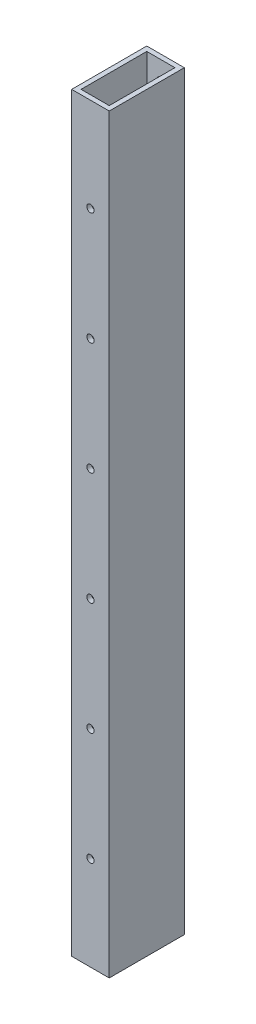
ISO-10303-21;
HEADER;
FILE_DESCRIPTION(('STEP AP214'),'2;1');
FILE_NAME('part.step','',(''),(''),'','','');
FILE_SCHEMA(('AUTOMOTIVE_DESIGN { 1 0 10303 214 1 1 1 1 }'));
ENDSEC;
DATA;
#1=APPLICATION_CONTEXT('core data for automotive mechanical design processes');
#2=APPLICATION_PROTOCOL_DEFINITION('international standard','automotive_design',2000,#1);
#3=PRODUCT_CONTEXT('',#1,'mechanical');
#4=PRODUCT('Part','Part','',(#3));
#5=PRODUCT_RELATED_PRODUCT_CATEGORY('part','',(#4));
#6=PRODUCT_DEFINITION_FORMATION('','',#4);
#7=PRODUCT_DEFINITION_CONTEXT('part definition',#1,'design');
#8=PRODUCT_DEFINITION('design','',#6,#7);
#9=PRODUCT_DEFINITION_SHAPE('','',#8);
#10=(LENGTH_UNIT() NAMED_UNIT(*) SI_UNIT(.MILLI.,.METRE.));
#11=(NAMED_UNIT(*) PLANE_ANGLE_UNIT() SI_UNIT($,.RADIAN.));
#12=(NAMED_UNIT(*) SI_UNIT($,.STERADIAN.) SOLID_ANGLE_UNIT());
#13=UNCERTAINTY_MEASURE_WITH_UNIT(LENGTH_MEASURE(1.E-05),#10,'distance_accuracy_value','');
#14=(GEOMETRIC_REPRESENTATION_CONTEXT(3) GLOBAL_UNCERTAINTY_ASSIGNED_CONTEXT((#13)) GLOBAL_UNIT_ASSIGNED_CONTEXT((#10,
#11,#12)) REPRESENTATION_CONTEXT('',''));
#15=CARTESIAN_POINT('',(0.,0.,0.));
#16=DIRECTION('',(0.,0.,1.));
#17=DIRECTION('',(1.,0.,0.));
#18=AXIS2_PLACEMENT_3D('',#15,#16,#17);
#19=CARTESIAN_POINT('',(0.,508.,0.));
#20=DIRECTION('',(0.,-1.,0.));
#21=DIRECTION('',(0.,0.,-1.));
#22=AXIS2_PLACEMENT_3D('',#19,#20,#21);
#23=PLANE('',#22);
#24=DIRECTION('',(0.,0.,1.));
#25=VECTOR('',#24,1.);
#26=CARTESIAN_POINT('',(0.,508.,0.));
#27=LINE('',#26,#25);
#28=CARTESIAN_POINT('',(0.,508.,-50.8));
#29=VERTEX_POINT('',#28);
#30=CARTESIAN_POINT('',(0.,508.,0.));
#31=VERTEX_POINT('',#30);
#32=EDGE_CURVE('E135',#29,#31,#27,.T.);
#33=ORIENTED_EDGE('',*,*,#32,.T.);
#34=DIRECTION('',(1.,0.,0.));
#35=VECTOR('',#34,1.);
#36=CARTESIAN_POINT('',(0.,508.,0.));
#37=LINE('',#36,#35);
#38=CARTESIAN_POINT('',(25.4,508.,0.));
#39=VERTEX_POINT('',#38);
#40=EDGE_CURVE('E138',#31,#39,#37,.T.);
#41=ORIENTED_EDGE('',*,*,#40,.T.);
#42=DIRECTION('',(0.,0.,-1.));
#43=VECTOR('',#42,1.);
#44=CARTESIAN_POINT('',(25.4,508.,0.));
#45=LINE('',#44,#43);
#46=CARTESIAN_POINT('',(25.4,508.,-50.8));
#47=VERTEX_POINT('',#46);
#48=EDGE_CURVE('E141',#39,#47,#45,.T.);
#49=ORIENTED_EDGE('',*,*,#48,.T.);
#50=DIRECTION('',(-1.,0.,0.));
#51=VECTOR('',#50,1.);
#52=CARTESIAN_POINT('',(0.,508.,-50.8));
#53=LINE('',#52,#51);
#54=EDGE_CURVE('E143',#47,#29,#53,.T.);
#55=ORIENTED_EDGE('',*,*,#54,.T.);
#56=EDGE_LOOP('',(#33,#41,#49,#55));
#57=FACE_BOUND('',#56,.T.);
#58=DIRECTION('',(1.,0.,0.));
#59=VECTOR('',#58,1.);
#60=CARTESIAN_POINT('',(3.175,508.,-3.175));
#61=LINE('',#60,#59);
#62=CARTESIAN_POINT('',(3.175,508.,-3.175));
#63=VERTEX_POINT('',#62);
#64=CARTESIAN_POINT('',(22.225,508.,-3.175));
#65=VERTEX_POINT('',#64);
#66=EDGE_CURVE('E97',#63,#65,#61,.T.);
#67=ORIENTED_EDGE('',*,*,#66,.F.);
#68=DIRECTION('',(0.,0.,1.));
#69=VECTOR('',#68,1.);
#70=CARTESIAN_POINT('',(3.175,508.,-3.175));
#71=LINE('',#70,#69);
#72=CARTESIAN_POINT('',(3.175,508.,-47.625));
#73=VERTEX_POINT('',#72);
#74=EDGE_CURVE('E119',#73,#63,#71,.T.);
#75=ORIENTED_EDGE('',*,*,#74,.F.);
#76=DIRECTION('',(-1.,0.,0.));
#77=VECTOR('',#76,1.);
#78=CARTESIAN_POINT('',(3.175,508.,-47.625));
#79=LINE('',#78,#77);
#80=CARTESIAN_POINT('',(22.225,508.,-47.625));
#81=VERTEX_POINT('',#80);
#82=EDGE_CURVE('E117',#81,#73,#79,.T.);
#83=ORIENTED_EDGE('',*,*,#82,.F.);
#84=DIRECTION('',(0.,0.,-1.));
#85=VECTOR('',#84,1.);
#86=CARTESIAN_POINT('',(22.225,508.,-3.175));
#87=LINE('',#86,#85);
#88=EDGE_CURVE('E105',#65,#81,#87,.T.);
#89=ORIENTED_EDGE('',*,*,#88,.F.);
#90=EDGE_LOOP('',(#67,#75,#83,#89));
#91=FACE_BOUND('',#90,.T.);
#92=ADVANCED_FACE('F32',(#57,#91),#23,.F.);
#93=CARTESIAN_POINT('',(0.,0.,0.));
#94=DIRECTION('',(0.,-1.,0.));
#95=DIRECTION('',(0.,0.,-1.));
#96=AXIS2_PLACEMENT_3D('',#93,#94,#95);
#97=PLANE('',#96);
#98=DIRECTION('',(0.,0.,1.));
#99=VECTOR('',#98,1.);
#100=CARTESIAN_POINT('',(0.,0.,0.));
#101=LINE('',#100,#99);
#102=CARTESIAN_POINT('',(0.,0.,-50.8));
#103=VERTEX_POINT('',#102);
#104=CARTESIAN_POINT('',(0.,0.,0.));
#105=VERTEX_POINT('',#104);
#106=EDGE_CURVE('E113',#103,#105,#101,.T.);
#107=ORIENTED_EDGE('',*,*,#106,.F.);
#108=DIRECTION('',(-1.,0.,0.));
#109=VECTOR('',#108,1.);
#110=CARTESIAN_POINT('',(0.,0.,-50.8));
#111=LINE('',#110,#109);
#112=CARTESIAN_POINT('',(25.4,0.,-50.8));
#113=VERTEX_POINT('',#112);
#114=EDGE_CURVE('E139',#113,#103,#111,.T.);
#115=ORIENTED_EDGE('',*,*,#114,.F.);
#116=DIRECTION('',(0.,0.,-1.));
#117=VECTOR('',#116,1.);
#118=CARTESIAN_POINT('',(25.4,0.,0.));
#119=LINE('',#118,#117);
#120=CARTESIAN_POINT('',(25.4,0.,0.));
#121=VERTEX_POINT('',#120);
#122=EDGE_CURVE('E150',#121,#113,#119,.T.);
#123=ORIENTED_EDGE('',*,*,#122,.F.);
#124=DIRECTION('',(1.,0.,0.));
#125=VECTOR('',#124,1.);
#126=CARTESIAN_POINT('',(0.,0.,0.));
#127=LINE('',#126,#125);
#128=EDGE_CURVE('E148',#105,#121,#127,.T.);
#129=ORIENTED_EDGE('',*,*,#128,.F.);
#130=EDGE_LOOP('',(#107,#115,#123,#129));
#131=FACE_BOUND('',#130,.T.);
#132=DIRECTION('',(0.,0.,1.));
#133=VECTOR('',#132,1.);
#134=CARTESIAN_POINT('',(3.175,0.,-3.175));
#135=LINE('',#134,#133);
#136=CARTESIAN_POINT('',(3.175,0.,-47.625));
#137=VERTEX_POINT('',#136);
#138=CARTESIAN_POINT('',(3.175,0.,-3.175));
#139=VERTEX_POINT('',#138);
#140=EDGE_CURVE('E106',#137,#139,#135,.T.);
#141=ORIENTED_EDGE('',*,*,#140,.T.);
#142=DIRECTION('',(1.,0.,0.));
#143=VECTOR('',#142,1.);
#144=CARTESIAN_POINT('',(3.175,0.,-3.175));
#145=LINE('',#144,#143);
#146=CARTESIAN_POINT('',(22.225,0.,-3.175));
#147=VERTEX_POINT('',#146);
#148=EDGE_CURVE('E55',#139,#147,#145,.T.);
#149=ORIENTED_EDGE('',*,*,#148,.T.);
#150=DIRECTION('',(0.,0.,-1.));
#151=VECTOR('',#150,1.);
#152=CARTESIAN_POINT('',(22.225,0.,-3.175));
#153=LINE('',#152,#151);
#154=CARTESIAN_POINT('',(22.225,0.,-47.625));
#155=VERTEX_POINT('',#154);
#156=EDGE_CURVE('E112',#147,#155,#153,.T.);
#157=ORIENTED_EDGE('',*,*,#156,.T.);
#158=DIRECTION('',(-1.,0.,0.));
#159=VECTOR('',#158,1.);
#160=CARTESIAN_POINT('',(3.175,0.,-47.625));
#161=LINE('',#160,#159);
#162=EDGE_CURVE('E127',#155,#137,#161,.T.);
#163=ORIENTED_EDGE('',*,*,#162,.T.);
#164=EDGE_LOOP('',(#141,#149,#157,#163));
#165=FACE_BOUND('',#164,.T.);
#166=ADVANCED_FACE('F168',(#131,#165),#97,.T.);
#167=CARTESIAN_POINT('',(0.,508.,0.));
#168=DIRECTION('',(1.,0.,0.));
#169=DIRECTION('',(0.,0.,-1.));
#170=AXIS2_PLACEMENT_3D('',#167,#168,#169);
#171=PLANE('',#170);
#172=CARTESIAN_POINT('',(0.,411.364898332171,-38.110518667742));
#173=DIRECTION('',(-1.,0.,0.));
#174=DIRECTION('',(0.,0.,1.));
#175=AXIS2_PLACEMENT_3D('',#172,#173,#174);
#176=CIRCLE('',#175,2.57968749999999);
#177=CARTESIAN_POINT('',(0.,411.364898332171,-35.530831167742));
#178=VERTEX_POINT('',#177);
#179=EDGE_CURVE('E323',#178,#178,#176,.T.);
#180=ORIENTED_EDGE('',*,*,#179,.F.);
#181=EDGE_LOOP('',(#180));
#182=FACE_BOUND('',#181,.T.);
#183=CARTESIAN_POINT('',(0.,411.364898332172,-12.710518667742));
#184=DIRECTION('',(-1.,0.,0.));
#185=DIRECTION('',(0.,0.,1.));
#186=AXIS2_PLACEMENT_3D('',#183,#184,#185);
#187=CIRCLE('',#186,2.5796875);
#188=CARTESIAN_POINT('',(0.,411.364898332172,-10.130831167742));
#189=VERTEX_POINT('',#188);
#190=EDGE_CURVE('E335',#189,#189,#187,.T.);
#191=ORIENTED_EDGE('',*,*,#190,.F.);
#192=EDGE_LOOP('',(#191));
#193=FACE_BOUND('',#192,.T.);
#194=CARTESIAN_POINT('',(0.,96.6351016623964,-12.7105186677505));
#195=DIRECTION('',(-1.,0.,0.));
#196=DIRECTION('',(0.,0.,1.));
#197=AXIS2_PLACEMENT_3D('',#194,#195,#196);
#198=CIRCLE('',#197,2.5796875);
#199=CARTESIAN_POINT('',(0.,96.6351016623964,-10.1308311677505));
#200=VERTEX_POINT('',#199);
#201=EDGE_CURVE('E329',#200,#200,#198,.T.);
#202=ORIENTED_EDGE('',*,*,#201,.F.);
#203=EDGE_LOOP('',(#202));
#204=FACE_BOUND('',#203,.T.);
#205=CARTESIAN_POINT('',(0.,96.6351016623965,-38.1105186677505));
#206=DIRECTION('',(-1.,0.,0.));
#207=DIRECTION('',(0.,0.,1.));
#208=AXIS2_PLACEMENT_3D('',#205,#206,#207);
#209=CIRCLE('',#208,2.5796875);
#210=CARTESIAN_POINT('',(0.,96.6351016623965,-35.5308311677505));
#211=VERTEX_POINT('',#210);
#212=EDGE_CURVE('E297',#211,#211,#209,.T.);
#213=ORIENTED_EDGE('',*,*,#212,.F.);
#214=EDGE_LOOP('',(#213));
#215=FACE_BOUND('',#214,.T.);
#216=ORIENTED_EDGE('',*,*,#106,.T.);
#217=DIRECTION('',(0.,-1.,0.));
#218=VECTOR('',#217,1.);
#219=CARTESIAN_POINT('',(0.,508.,0.));
#220=LINE('',#219,#218);
#221=EDGE_CURVE('E11',#31,#105,#220,.T.);
#222=ORIENTED_EDGE('',*,*,#221,.F.);
#223=ORIENTED_EDGE('',*,*,#32,.F.);
#224=DIRECTION('',(0.,-1.,0.));
#225=VECTOR('',#224,1.);
#226=CARTESIAN_POINT('',(0.,508.,-50.8));
#227=LINE('',#226,#225);
#228=EDGE_CURVE('E145',#29,#103,#227,.T.);
#229=ORIENTED_EDGE('',*,*,#228,.T.);
#230=EDGE_LOOP('',(#216,#222,#223,#229));
#231=FACE_BOUND('',#230,.T.);
#232=ADVANCED_FACE('F34',(#182,#193,#204,#215,#231),#171,.F.);
#233=CARTESIAN_POINT('',(0.,508.,0.));
#234=DIRECTION('',(0.,0.,-1.));
#235=DIRECTION('',(-1.,0.,0.));
#236=AXIS2_PLACEMENT_3D('',#233,#234,#235);
#237=PLANE('',#236);
#238=CARTESIAN_POINT('',(12.7000000000002,139.7,0.));
#239=DIRECTION('',(0.,0.,1.));
#240=DIRECTION('',(1.,0.,0.));
#241=AXIS2_PLACEMENT_3D('',#238,#239,#240);
#242=CIRCLE('',#241,2.46380000000002);
#243=CARTESIAN_POINT('',(15.1638000000002,139.7,0.));
#244=VERTEX_POINT('',#243);
#245=EDGE_CURVE('E289',#244,#244,#242,.T.);
#246=ORIENTED_EDGE('',*,*,#245,.F.);
#247=EDGE_LOOP('',(#246));
#248=FACE_BOUND('',#247,.T.);
#249=CARTESIAN_POINT('',(12.7000000000002,215.9,0.));
#250=DIRECTION('',(0.,0.,1.));
#251=DIRECTION('',(1.,0.,0.));
#252=AXIS2_PLACEMENT_3D('',#249,#250,#251);
#253=CIRCLE('',#252,2.46380000000002);
#254=CARTESIAN_POINT('',(15.1638000000002,215.9,0.));
#255=VERTEX_POINT('',#254);
#256=EDGE_CURVE('E312',#255,#255,#253,.T.);
#257=ORIENTED_EDGE('',*,*,#256,.F.);
#258=EDGE_LOOP('',(#257));
#259=FACE_BOUND('',#258,.T.);
#260=CARTESIAN_POINT('',(12.7000000000002,292.1,0.));
#261=DIRECTION('',(0.,0.,1.));
#262=DIRECTION('',(1.,0.,0.));
#263=AXIS2_PLACEMENT_3D('',#260,#261,#262);
#264=CIRCLE('',#263,2.4638);
#265=CARTESIAN_POINT('',(15.1638000000002,292.1,0.));
#266=VERTEX_POINT('',#265);
#267=EDGE_CURVE('E306',#266,#266,#264,.T.);
#268=ORIENTED_EDGE('',*,*,#267,.F.);
#269=EDGE_LOOP('',(#268));
#270=FACE_BOUND('',#269,.T.);
#271=CARTESIAN_POINT('',(12.7000000000002,368.3,0.));
#272=DIRECTION('',(0.,0.,1.));
#273=DIRECTION('',(1.,0.,0.));
#274=AXIS2_PLACEMENT_3D('',#271,#272,#273);
#275=CIRCLE('',#274,2.46380000000002);
#276=CARTESIAN_POINT('',(15.1638000000002,368.3,0.));
#277=VERTEX_POINT('',#276);
#278=EDGE_CURVE('E298',#277,#277,#275,.T.);
#279=ORIENTED_EDGE('',*,*,#278,.F.);
#280=EDGE_LOOP('',(#279));
#281=FACE_BOUND('',#280,.T.);
#282=CARTESIAN_POINT('',(12.7,444.5,0.));
#283=DIRECTION('',(0.,0.,1.));
#284=DIRECTION('',(1.,0.,0.));
#285=AXIS2_PLACEMENT_3D('',#282,#283,#284);
#286=CIRCLE('',#285,2.46380000000003);
#287=CARTESIAN_POINT('',(15.1638000000001,444.5,0.));
#288=VERTEX_POINT('',#287);
#289=EDGE_CURVE('E290',#288,#288,#286,.T.);
#290=ORIENTED_EDGE('',*,*,#289,.F.);
#291=EDGE_LOOP('',(#290));
#292=FACE_BOUND('',#291,.T.);
#293=CARTESIAN_POINT('',(12.7000000000002,63.4999999999999,0.));
#294=DIRECTION('',(0.,0.,1.));
#295=DIRECTION('',(1.,0.,0.));
#296=AXIS2_PLACEMENT_3D('',#293,#294,#295);
#297=CIRCLE('',#296,2.46380000000002);
#298=CARTESIAN_POINT('',(15.1638000000002,63.4999999999999,0.));
#299=VERTEX_POINT('',#298);
#300=EDGE_CURVE('E250',#299,#299,#297,.T.);
#301=ORIENTED_EDGE('',*,*,#300,.F.);
#302=EDGE_LOOP('',(#301));
#303=FACE_BOUND('',#302,.T.);
#304=ORIENTED_EDGE('',*,*,#128,.T.);
#305=DIRECTION('',(0.,-1.,0.));
#306=VECTOR('',#305,1.);
#307=CARTESIAN_POINT('',(25.4,508.,0.));
#308=LINE('',#307,#306);
#309=EDGE_CURVE('E40',#39,#121,#308,.T.);
#310=ORIENTED_EDGE('',*,*,#309,.F.);
#311=ORIENTED_EDGE('',*,*,#40,.F.);
#312=ORIENTED_EDGE('',*,*,#221,.T.);
#313=EDGE_LOOP('',(#304,#310,#311,#312));
#314=FACE_BOUND('',#313,.T.);
#315=ADVANCED_FACE('F178',(#248,#259,#270,#281,#292,#303,#314),#237,.F.);
#316=CARTESIAN_POINT('',(25.4,508.,0.));
#317=DIRECTION('',(-1.,0.,0.));
#318=DIRECTION('',(0.,0.,1.));
#319=AXIS2_PLACEMENT_3D('',#316,#317,#318);
#320=PLANE('',#319);
#321=ORIENTED_EDGE('',*,*,#122,.T.);
#322=DIRECTION('',(0.,-1.,0.));
#323=VECTOR('',#322,1.);
#324=CARTESIAN_POINT('',(25.4,508.,-50.8));
#325=LINE('',#324,#323);
#326=EDGE_CURVE('E155',#47,#113,#325,.T.);
#327=ORIENTED_EDGE('',*,*,#326,.F.);
#328=ORIENTED_EDGE('',*,*,#48,.F.);
#329=ORIENTED_EDGE('',*,*,#309,.T.);
#330=EDGE_LOOP('',(#321,#327,#328,#329));
#331=FACE_BOUND('',#330,.T.);
#332=ADVANCED_FACE('F162',(#331),#320,.F.);
#333=CARTESIAN_POINT('',(0.,508.,-50.8));
#334=DIRECTION('',(0.,0.,1.));
#335=DIRECTION('',(1.,0.,0.));
#336=AXIS2_PLACEMENT_3D('',#333,#334,#335);
#337=PLANE('',#336);
#338=CARTESIAN_POINT('',(12.6999999999999,50.7999999999999,-50.8));
#339=DIRECTION('',(0.,0.,-1.));
#340=DIRECTION('',(-1.,0.,0.));
#341=AXIS2_PLACEMENT_3D('',#338,#339,#340);
#342=CIRCLE('',#341,2.4638);
#343=CARTESIAN_POINT('',(10.2361999999999,50.7999999999999,-50.8));
#344=VERTEX_POINT('',#343);
#345=EDGE_CURVE('E207',#344,#344,#342,.T.);
#346=ORIENTED_EDGE('',*,*,#345,.F.);
#347=EDGE_LOOP('',(#346));
#348=FACE_BOUND('',#347,.T.);
#349=CARTESIAN_POINT('',(12.7000000000001,177.8,-50.8));
#350=DIRECTION('',(0.,0.,-1.));
#351=DIRECTION('',(-1.,0.,0.));
#352=AXIS2_PLACEMENT_3D('',#349,#350,#351);
#353=CIRCLE('',#352,2.46379999999999);
#354=CARTESIAN_POINT('',(10.2362000000001,177.8,-50.8));
#355=VERTEX_POINT('',#354);
#356=EDGE_CURVE('E211',#355,#355,#353,.T.);
#357=ORIENTED_EDGE('',*,*,#356,.F.);
#358=EDGE_LOOP('',(#357));
#359=FACE_BOUND('',#358,.T.);
#360=CARTESIAN_POINT('',(12.7000000000001,215.9,-50.8));
#361=DIRECTION('',(0.,0.,-1.));
#362=DIRECTION('',(-1.,0.,0.));
#363=AXIS2_PLACEMENT_3D('',#360,#361,#362);
#364=CIRCLE('',#363,2.4638);
#365=CARTESIAN_POINT('',(10.2362000000001,215.9,-50.8));
#366=VERTEX_POINT('',#365);
#367=EDGE_CURVE('E215',#366,#366,#364,.T.);
#368=ORIENTED_EDGE('',*,*,#367,.F.);
#369=EDGE_LOOP('',(#368));
#370=FACE_BOUND('',#369,.T.);
#371=CARTESIAN_POINT('',(12.7000000000001,241.3,-50.8));
#372=DIRECTION('',(0.,0.,-1.));
#373=DIRECTION('',(-1.,0.,0.));
#374=AXIS2_PLACEMENT_3D('',#371,#372,#373);
#375=CIRCLE('',#374,2.46380000000001);
#376=CARTESIAN_POINT('',(10.2362000000001,241.3,-50.8));
#377=VERTEX_POINT('',#376);
#378=EDGE_CURVE('E219',#377,#377,#375,.T.);
#379=ORIENTED_EDGE('',*,*,#378,.F.);
#380=EDGE_LOOP('',(#379));
#381=FACE_BOUND('',#380,.T.);
#382=CARTESIAN_POINT('',(12.7000000000001,266.7,-50.8));
#383=DIRECTION('',(0.,0.,-1.));
#384=DIRECTION('',(-1.,0.,0.));
#385=AXIS2_PLACEMENT_3D('',#382,#383,#384);
#386=CIRCLE('',#385,2.46379999999999);
#387=CARTESIAN_POINT('',(10.2362000000001,266.7,-50.8));
#388=VERTEX_POINT('',#387);
#389=EDGE_CURVE('E223',#388,#388,#386,.T.);
#390=ORIENTED_EDGE('',*,*,#389,.F.);
#391=EDGE_LOOP('',(#390));
#392=FACE_BOUND('',#391,.T.);
#393=CARTESIAN_POINT('',(12.7000000000001,292.1,-50.8));
#394=DIRECTION('',(0.,0.,-1.));
#395=DIRECTION('',(-1.,0.,0.));
#396=AXIS2_PLACEMENT_3D('',#393,#394,#395);
#397=CIRCLE('',#396,2.46380000000001);
#398=CARTESIAN_POINT('',(10.2362000000001,292.1,-50.8));
#399=VERTEX_POINT('',#398);
#400=EDGE_CURVE('E227',#399,#399,#397,.T.);
#401=ORIENTED_EDGE('',*,*,#400,.F.);
#402=EDGE_LOOP('',(#401));
#403=FACE_BOUND('',#402,.T.);
#404=CARTESIAN_POINT('',(12.7000000000001,330.2,-50.8));
#405=DIRECTION('',(0.,0.,-1.));
#406=DIRECTION('',(-1.,0.,0.));
#407=AXIS2_PLACEMENT_3D('',#404,#405,#406);
#408=CIRCLE('',#407,2.46380000000001);
#409=CARTESIAN_POINT('',(10.2362000000001,330.2,-50.8));
#410=VERTEX_POINT('',#409);
#411=EDGE_CURVE('E231',#410,#410,#408,.T.);
#412=ORIENTED_EDGE('',*,*,#411,.F.);
#413=EDGE_LOOP('',(#412));
#414=FACE_BOUND('',#413,.T.);
#415=CARTESIAN_POINT('',(12.7000000000001,457.2,-50.8));
#416=DIRECTION('',(0.,0.,-1.));
#417=DIRECTION('',(-1.,0.,0.));
#418=AXIS2_PLACEMENT_3D('',#415,#416,#417);
#419=CIRCLE('',#418,2.46379999999999);
#420=CARTESIAN_POINT('',(10.2362000000001,457.2,-50.8));
#421=VERTEX_POINT('',#420);
#422=EDGE_CURVE('E235',#421,#421,#419,.T.);
#423=ORIENTED_EDGE('',*,*,#422,.F.);
#424=EDGE_LOOP('',(#423));
#425=FACE_BOUND('',#424,.T.);
#426=CARTESIAN_POINT('',(12.7000000000001,495.3,-50.8));
#427=DIRECTION('',(0.,0.,-1.));
#428=DIRECTION('',(-1.,0.,0.));
#429=AXIS2_PLACEMENT_3D('',#426,#427,#428);
#430=CIRCLE('',#429,2.4638);
#431=CARTESIAN_POINT('',(10.2362000000001,495.3,-50.8));
#432=VERTEX_POINT('',#431);
#433=EDGE_CURVE('E239',#432,#432,#430,.T.);
#434=ORIENTED_EDGE('',*,*,#433,.F.);
#435=EDGE_LOOP('',(#434));
#436=FACE_BOUND('',#435,.T.);
#437=CARTESIAN_POINT('',(12.6999999999999,12.6999999999999,-50.8));
#438=DIRECTION('',(0.,0.,-1.));
#439=DIRECTION('',(-1.,0.,0.));
#440=AXIS2_PLACEMENT_3D('',#437,#438,#439);
#441=CIRCLE('',#440,2.4638);
#442=CARTESIAN_POINT('',(10.2361999999999,12.6999999999999,-50.8));
#443=VERTEX_POINT('',#442);
#444=EDGE_CURVE('E125',#443,#443,#441,.T.);
#445=ORIENTED_EDGE('',*,*,#444,.F.);
#446=EDGE_LOOP('',(#445));
#447=FACE_BOUND('',#446,.T.);
#448=ORIENTED_EDGE('',*,*,#114,.T.);
#449=ORIENTED_EDGE('',*,*,#228,.F.);
#450=ORIENTED_EDGE('',*,*,#54,.F.);
#451=ORIENTED_EDGE('',*,*,#326,.T.);
#452=EDGE_LOOP('',(#448,#449,#450,#451));
#453=FACE_BOUND('',#452,.T.);
#454=ADVANCED_FACE('F172',(#348,#359,#370,#381,#392,#403,#414,#425,#436,#447,#453),#337,.F.);
#455=CARTESIAN_POINT('',(3.175,508.,-3.175));
#456=DIRECTION('',(0.,0.,-1.));
#457=DIRECTION('',(-1.,0.,0.));
#458=AXIS2_PLACEMENT_3D('',#455,#456,#457);
#459=PLANE('',#458);
#460=CARTESIAN_POINT('',(12.7000000000002,139.7,-3.175));
#461=DIRECTION('',(0.,0.,-1.));
#462=DIRECTION('',(-1.,0.,0.));
#463=AXIS2_PLACEMENT_3D('',#460,#461,#462);
#464=CIRCLE('',#463,2.46380000000002);
#465=CARTESIAN_POINT('',(10.2362000000001,139.7,-3.175));
#466=VERTEX_POINT('',#465);
#467=EDGE_CURVE('E315',#466,#466,#464,.F.);
#468=ORIENTED_EDGE('',*,*,#467,.T.);
#469=EDGE_LOOP('',(#468));
#470=FACE_BOUND('',#469,.T.);
#471=CARTESIAN_POINT('',(12.7000000000002,215.9,-3.175));
#472=DIRECTION('',(0.,0.,-1.));
#473=DIRECTION('',(-1.,0.,0.));
#474=AXIS2_PLACEMENT_3D('',#471,#472,#473);
#475=CIRCLE('',#474,2.46380000000002);
#476=CARTESIAN_POINT('',(10.2362000000001,215.9,-3.175));
#477=VERTEX_POINT('',#476);
#478=EDGE_CURVE('E309',#477,#477,#475,.F.);
#479=ORIENTED_EDGE('',*,*,#478,.T.);
#480=EDGE_LOOP('',(#479));
#481=FACE_BOUND('',#480,.T.);
#482=CARTESIAN_POINT('',(12.7000000000002,292.1,-3.175));
#483=DIRECTION('',(0.,0.,-1.));
#484=DIRECTION('',(-1.,0.,0.));
#485=AXIS2_PLACEMENT_3D('',#482,#483,#484);
#486=CIRCLE('',#485,2.4638);
#487=CARTESIAN_POINT('',(10.2362000000002,292.1,-3.175));
#488=VERTEX_POINT('',#487);
#489=EDGE_CURVE('E301',#488,#488,#486,.F.);
#490=ORIENTED_EDGE('',*,*,#489,.T.);
#491=EDGE_LOOP('',(#490));
#492=FACE_BOUND('',#491,.T.);
#493=CARTESIAN_POINT('',(12.7000000000002,368.3,-3.175));
#494=DIRECTION('',(0.,0.,-1.));
#495=DIRECTION('',(-1.,0.,0.));
#496=AXIS2_PLACEMENT_3D('',#493,#494,#495);
#497=CIRCLE('',#496,2.46380000000002);
#498=CARTESIAN_POINT('',(10.2362000000001,368.3,-3.175));
#499=VERTEX_POINT('',#498);
#500=EDGE_CURVE('E293',#499,#499,#497,.F.);
#501=ORIENTED_EDGE('',*,*,#500,.T.);
#502=EDGE_LOOP('',(#501));
#503=FACE_BOUND('',#502,.T.);
#504=CARTESIAN_POINT('',(12.7,444.5,-3.175));
#505=DIRECTION('',(0.,0.,-1.));
#506=DIRECTION('',(-1.,0.,0.));
#507=AXIS2_PLACEMENT_3D('',#504,#505,#506);
#508=CIRCLE('',#507,2.46380000000003);
#509=CARTESIAN_POINT('',(10.2362,444.5,-3.175));
#510=VERTEX_POINT('',#509);
#511=EDGE_CURVE('E294',#510,#510,#508,.F.);
#512=ORIENTED_EDGE('',*,*,#511,.T.);
#513=EDGE_LOOP('',(#512));
#514=FACE_BOUND('',#513,.T.);
#515=CARTESIAN_POINT('',(12.7000000000002,63.4999999999999,-3.175));
#516=DIRECTION('',(0.,0.,-1.));
#517=DIRECTION('',(-1.,0.,0.));
#518=AXIS2_PLACEMENT_3D('',#515,#516,#517);
#519=CIRCLE('',#518,2.46380000000002);
#520=CARTESIAN_POINT('',(10.2362000000001,63.4999999999999,-3.175));
#521=VERTEX_POINT('',#520);
#522=EDGE_CURVE('E286',#521,#521,#519,.F.);
#523=ORIENTED_EDGE('',*,*,#522,.T.);
#524=EDGE_LOOP('',(#523));
#525=FACE_BOUND('',#524,.T.);
#526=ORIENTED_EDGE('',*,*,#148,.F.);
#527=DIRECTION('',(0.,-1.,0.));
#528=VECTOR('',#527,1.);
#529=CARTESIAN_POINT('',(3.175,508.,-3.175));
#530=LINE('',#529,#528);
#531=EDGE_CURVE('E101',#63,#139,#530,.T.);
#532=ORIENTED_EDGE('',*,*,#531,.F.);
#533=ORIENTED_EDGE('',*,*,#66,.T.);
#534=DIRECTION('',(0.,-1.,0.));
#535=VECTOR('',#534,1.);
#536=CARTESIAN_POINT('',(22.225,508.,-3.175));
#537=LINE('',#536,#535);
#538=EDGE_CURVE('E100',#65,#147,#537,.T.);
#539=ORIENTED_EDGE('',*,*,#538,.T.);
#540=EDGE_LOOP('',(#526,#532,#533,#539));
#541=FACE_BOUND('',#540,.T.);
#542=ADVANCED_FACE('F99',(#470,#481,#492,#503,#514,#525,#541),#459,.T.);
#543=CARTESIAN_POINT('',(22.225,508.,-3.175));
#544=DIRECTION('',(-1.,0.,0.));
#545=DIRECTION('',(0.,0.,1.));
#546=AXIS2_PLACEMENT_3D('',#543,#544,#545);
#547=PLANE('',#546);
#548=ORIENTED_EDGE('',*,*,#156,.F.);
#549=ORIENTED_EDGE('',*,*,#538,.F.);
#550=ORIENTED_EDGE('',*,*,#88,.T.);
#551=DIRECTION('',(0.,-1.,0.));
#552=VECTOR('',#551,1.);
#553=CARTESIAN_POINT('',(22.225,508.,-47.625));
#554=LINE('',#553,#552);
#555=EDGE_CURVE('E114',#81,#155,#554,.T.);
#556=ORIENTED_EDGE('',*,*,#555,.T.);
#557=EDGE_LOOP('',(#548,#549,#550,#556));
#558=FACE_BOUND('',#557,.T.);
#559=ADVANCED_FACE('F109',(#558),#547,.T.);
#560=CARTESIAN_POINT('',(3.175,508.,-47.625));
#561=DIRECTION('',(0.,0.,1.));
#562=DIRECTION('',(1.,0.,0.));
#563=AXIS2_PLACEMENT_3D('',#560,#561,#562);
#564=PLANE('',#563);
#565=CARTESIAN_POINT('',(12.6999999999999,50.7999999999999,-47.625));
#566=DIRECTION('',(0.,0.,1.));
#567=DIRECTION('',(1.,0.,0.));
#568=AXIS2_PLACEMENT_3D('',#565,#566,#567);
#569=CIRCLE('',#568,2.4638);
#570=CARTESIAN_POINT('',(15.1637999999999,50.7999999999999,-47.625));
#571=VERTEX_POINT('',#570);
#572=EDGE_CURVE('E280',#571,#571,#569,.F.);
#573=ORIENTED_EDGE('',*,*,#572,.T.);
#574=EDGE_LOOP('',(#573));
#575=FACE_BOUND('',#574,.T.);
#576=CARTESIAN_POINT('',(12.7000000000001,177.8,-47.625));
#577=DIRECTION('',(0.,0.,1.));
#578=DIRECTION('',(1.,0.,0.));
#579=AXIS2_PLACEMENT_3D('',#576,#577,#578);
#580=CIRCLE('',#579,2.46379999999999);
#581=CARTESIAN_POINT('',(15.1638000000001,177.8,-47.625));
#582=VERTEX_POINT('',#581);
#583=EDGE_CURVE('E276',#582,#582,#580,.F.);
#584=ORIENTED_EDGE('',*,*,#583,.T.);
#585=EDGE_LOOP('',(#584));
#586=FACE_BOUND('',#585,.T.);
#587=CARTESIAN_POINT('',(12.7000000000001,215.9,-47.625));
#588=DIRECTION('',(0.,0.,1.));
#589=DIRECTION('',(1.,0.,0.));
#590=AXIS2_PLACEMENT_3D('',#587,#588,#589);
#591=CIRCLE('',#590,2.4638);
#592=CARTESIAN_POINT('',(15.1638000000001,215.9,-47.625));
#593=VERTEX_POINT('',#592);
#594=EDGE_CURVE('E272',#593,#593,#591,.F.);
#595=ORIENTED_EDGE('',*,*,#594,.T.);
#596=EDGE_LOOP('',(#595));
#597=FACE_BOUND('',#596,.T.);
#598=CARTESIAN_POINT('',(12.7000000000001,241.3,-47.625));
#599=DIRECTION('',(0.,0.,1.));
#600=DIRECTION('',(1.,0.,0.));
#601=AXIS2_PLACEMENT_3D('',#598,#599,#600);
#602=CIRCLE('',#601,2.46380000000001);
#603=CARTESIAN_POINT('',(15.1638000000001,241.3,-47.625));
#604=VERTEX_POINT('',#603);
#605=EDGE_CURVE('E268',#604,#604,#602,.F.);
#606=ORIENTED_EDGE('',*,*,#605,.T.);
#607=EDGE_LOOP('',(#606));
#608=FACE_BOUND('',#607,.T.);
#609=CARTESIAN_POINT('',(12.7000000000001,266.7,-47.625));
#610=DIRECTION('',(0.,0.,1.));
#611=DIRECTION('',(1.,0.,0.));
#612=AXIS2_PLACEMENT_3D('',#609,#610,#611);
#613=CIRCLE('',#612,2.46379999999999);
#614=CARTESIAN_POINT('',(15.1638000000001,266.7,-47.625));
#615=VERTEX_POINT('',#614);
#616=EDGE_CURVE('E264',#615,#615,#613,.F.);
#617=ORIENTED_EDGE('',*,*,#616,.T.);
#618=EDGE_LOOP('',(#617));
#619=FACE_BOUND('',#618,.T.);
#620=CARTESIAN_POINT('',(12.7000000000001,292.1,-47.625));
#621=DIRECTION('',(0.,0.,1.));
#622=DIRECTION('',(1.,0.,0.));
#623=AXIS2_PLACEMENT_3D('',#620,#621,#622);
#624=CIRCLE('',#623,2.46380000000001);
#625=CARTESIAN_POINT('',(15.1638000000001,292.1,-47.625));
#626=VERTEX_POINT('',#625);
#627=EDGE_CURVE('E260',#626,#626,#624,.F.);
#628=ORIENTED_EDGE('',*,*,#627,.T.);
#629=EDGE_LOOP('',(#628));
#630=FACE_BOUND('',#629,.T.);
#631=CARTESIAN_POINT('',(12.7000000000001,330.2,-47.625));
#632=DIRECTION('',(0.,0.,1.));
#633=DIRECTION('',(1.,0.,0.));
#634=AXIS2_PLACEMENT_3D('',#631,#632,#633);
#635=CIRCLE('',#634,2.46380000000001);
#636=CARTESIAN_POINT('',(15.1638000000001,330.2,-47.625));
#637=VERTEX_POINT('',#636);
#638=EDGE_CURVE('E256',#637,#637,#635,.F.);
#639=ORIENTED_EDGE('',*,*,#638,.T.);
#640=EDGE_LOOP('',(#639));
#641=FACE_BOUND('',#640,.T.);
#642=CARTESIAN_POINT('',(12.7000000000001,457.2,-47.625));
#643=DIRECTION('',(0.,0.,1.));
#644=DIRECTION('',(1.,0.,0.));
#645=AXIS2_PLACEMENT_3D('',#642,#643,#644);
#646=CIRCLE('',#645,2.46379999999999);
#647=CARTESIAN_POINT('',(15.1638000000001,457.2,-47.625));
#648=VERTEX_POINT('',#647);
#649=EDGE_CURVE('E252',#648,#648,#646,.F.);
#650=ORIENTED_EDGE('',*,*,#649,.T.);
#651=EDGE_LOOP('',(#650));
#652=FACE_BOUND('',#651,.T.);
#653=CARTESIAN_POINT('',(12.7000000000001,495.3,-47.625));
#654=DIRECTION('',(0.,0.,1.));
#655=DIRECTION('',(1.,0.,0.));
#656=AXIS2_PLACEMENT_3D('',#653,#654,#655);
#657=CIRCLE('',#656,2.4638);
#658=CARTESIAN_POINT('',(15.1638000000001,495.3,-47.625));
#659=VERTEX_POINT('',#658);
#660=EDGE_CURVE('E247',#659,#659,#657,.F.);
#661=ORIENTED_EDGE('',*,*,#660,.T.);
#662=EDGE_LOOP('',(#661));
#663=FACE_BOUND('',#662,.T.);
#664=CARTESIAN_POINT('',(12.6999999999999,12.6999999999999,-47.625));
#665=DIRECTION('',(0.,0.,1.));
#666=DIRECTION('',(1.,0.,0.));
#667=AXIS2_PLACEMENT_3D('',#664,#665,#666);
#668=CIRCLE('',#667,2.4638);
#669=CARTESIAN_POINT('',(15.1637999999999,12.6999999999999,-47.625));
#670=VERTEX_POINT('',#669);
#671=EDGE_CURVE('E243',#670,#670,#668,.F.);
#672=ORIENTED_EDGE('',*,*,#671,.T.);
#673=EDGE_LOOP('',(#672));
#674=FACE_BOUND('',#673,.T.);
#675=ORIENTED_EDGE('',*,*,#162,.F.);
#676=ORIENTED_EDGE('',*,*,#555,.F.);
#677=ORIENTED_EDGE('',*,*,#82,.T.);
#678=DIRECTION('',(0.,-1.,0.));
#679=VECTOR('',#678,1.);
#680=CARTESIAN_POINT('',(3.175,508.,-47.625));
#681=LINE('',#680,#679);
#682=EDGE_CURVE('E47',#73,#137,#681,.T.);
#683=ORIENTED_EDGE('',*,*,#682,.T.);
#684=EDGE_LOOP('',(#675,#676,#677,#683));
#685=FACE_BOUND('',#684,.T.);
#686=ADVANCED_FACE('F433',(#575,#586,#597,#608,#619,#630,#641,#652,#663,#674,#685),#564,.T.);
#687=CARTESIAN_POINT('',(3.175,508.,-3.175));
#688=DIRECTION('',(1.,0.,0.));
#689=DIRECTION('',(0.,0.,-1.));
#690=AXIS2_PLACEMENT_3D('',#687,#688,#689);
#691=PLANE('',#690);
#692=CARTESIAN_POINT('',(3.175,411.364898332171,-38.110518667742));
#693=DIRECTION('',(1.,0.,0.));
#694=DIRECTION('',(0.,0.,-1.));
#695=AXIS2_PLACEMENT_3D('',#692,#693,#694);
#696=CIRCLE('',#695,2.57968749999999);
#697=CARTESIAN_POINT('',(3.175,411.364898332171,-40.690206167742));
#698=VERTEX_POINT('',#697);
#699=EDGE_CURVE('E338',#698,#698,#696,.F.);
#700=ORIENTED_EDGE('',*,*,#699,.T.);
#701=EDGE_LOOP('',(#700));
#702=FACE_BOUND('',#701,.T.);
#703=CARTESIAN_POINT('',(3.175,411.364898332172,-12.710518667742));
#704=DIRECTION('',(1.,0.,0.));
#705=DIRECTION('',(0.,0.,-1.));
#706=AXIS2_PLACEMENT_3D('',#703,#704,#705);
#707=CIRCLE('',#706,2.5796875);
#708=CARTESIAN_POINT('',(3.175,411.364898332172,-15.290206167742));
#709=VERTEX_POINT('',#708);
#710=EDGE_CURVE('E332',#709,#709,#707,.F.);
#711=ORIENTED_EDGE('',*,*,#710,.T.);
#712=EDGE_LOOP('',(#711));
#713=FACE_BOUND('',#712,.T.);
#714=CARTESIAN_POINT('',(3.175,96.6351016623964,-12.7105186677505));
#715=DIRECTION('',(1.,0.,0.));
#716=DIRECTION('',(0.,0.,-1.));
#717=AXIS2_PLACEMENT_3D('',#714,#715,#716);
#718=CIRCLE('',#717,2.5796875);
#719=CARTESIAN_POINT('',(3.175,96.6351016623964,-15.2902061677505));
#720=VERTEX_POINT('',#719);
#721=EDGE_CURVE('E326',#720,#720,#718,.F.);
#722=ORIENTED_EDGE('',*,*,#721,.T.);
#723=EDGE_LOOP('',(#722));
#724=FACE_BOUND('',#723,.T.);
#725=CARTESIAN_POINT('',(3.175,96.6351016623965,-38.1105186677505));
#726=DIRECTION('',(1.,0.,0.));
#727=DIRECTION('',(0.,0.,-1.));
#728=AXIS2_PLACEMENT_3D('',#725,#726,#727);
#729=CIRCLE('',#728,2.5796875);
#730=CARTESIAN_POINT('',(3.175,96.6351016623965,-40.6902061677505));
#731=VERTEX_POINT('',#730);
#732=EDGE_CURVE('E320',#731,#731,#729,.F.);
#733=ORIENTED_EDGE('',*,*,#732,.T.);
#734=EDGE_LOOP('',(#733));
#735=FACE_BOUND('',#734,.T.);
#736=ORIENTED_EDGE('',*,*,#140,.F.);
#737=ORIENTED_EDGE('',*,*,#682,.F.);
#738=ORIENTED_EDGE('',*,*,#74,.T.);
#739=ORIENTED_EDGE('',*,*,#531,.T.);
#740=EDGE_LOOP('',(#736,#737,#738,#739));
#741=FACE_BOUND('',#740,.T.);
#742=ADVANCED_FACE('F429',(#702,#713,#724,#735,#741),#691,.T.);
#743=CARTESIAN_POINT('',(12.6999999999999,12.6999999999999,0.001000000000001));
#744=DIRECTION('',(0.,0.,-1.));
#745=DIRECTION('',(-1.,0.,0.));
#746=AXIS2_PLACEMENT_3D('',#743,#744,#745);
#747=CYLINDRICAL_SURFACE('',#746,2.4638);
#748=ORIENTED_EDGE('',*,*,#671,.F.);
#749=EDGE_LOOP('',(#748));
#750=FACE_BOUND('',#749,.T.);
#751=ORIENTED_EDGE('',*,*,#444,.T.);
#752=EDGE_LOOP('',(#751));
#753=FACE_BOUND('',#752,.T.);
#754=ADVANCED_FACE('F425',(#750,#753),#747,.F.);
#755=CARTESIAN_POINT('',(12.7000000000001,495.3,0.001000000000001));
#756=DIRECTION('',(0.,0.,-1.));
#757=DIRECTION('',(-1.,0.,0.));
#758=AXIS2_PLACEMENT_3D('',#755,#756,#757);
#759=CYLINDRICAL_SURFACE('',#758,2.4638);
#760=ORIENTED_EDGE('',*,*,#660,.F.);
#761=EDGE_LOOP('',(#760));
#762=FACE_BOUND('',#761,.T.);
#763=ORIENTED_EDGE('',*,*,#433,.T.);
#764=EDGE_LOOP('',(#763));
#765=FACE_BOUND('',#764,.T.);
#766=ADVANCED_FACE('F421',(#762,#765),#759,.F.);
#767=CARTESIAN_POINT('',(12.7000000000001,457.2,0.001000000000001));
#768=DIRECTION('',(0.,0.,-1.));
#769=DIRECTION('',(-1.,0.,0.));
#770=AXIS2_PLACEMENT_3D('',#767,#768,#769);
#771=CYLINDRICAL_SURFACE('',#770,2.46379999999999);
#772=ORIENTED_EDGE('',*,*,#649,.F.);
#773=EDGE_LOOP('',(#772));
#774=FACE_BOUND('',#773,.T.);
#775=ORIENTED_EDGE('',*,*,#422,.T.);
#776=EDGE_LOOP('',(#775));
#777=FACE_BOUND('',#776,.T.);
#778=ADVANCED_FACE('F417',(#774,#777),#771,.F.);
#779=CARTESIAN_POINT('',(12.7000000000001,330.2,0.001000000000001));
#780=DIRECTION('',(0.,0.,-1.));
#781=DIRECTION('',(-1.,0.,0.));
#782=AXIS2_PLACEMENT_3D('',#779,#780,#781);
#783=CYLINDRICAL_SURFACE('',#782,2.46380000000001);
#784=ORIENTED_EDGE('',*,*,#638,.F.);
#785=EDGE_LOOP('',(#784));
#786=FACE_BOUND('',#785,.T.);
#787=ORIENTED_EDGE('',*,*,#411,.T.);
#788=EDGE_LOOP('',(#787));
#789=FACE_BOUND('',#788,.T.);
#790=ADVANCED_FACE('F413',(#786,#789),#783,.F.);
#791=CARTESIAN_POINT('',(12.7000000000001,292.1,0.001000000000001));
#792=DIRECTION('',(0.,0.,-1.));
#793=DIRECTION('',(-1.,0.,0.));
#794=AXIS2_PLACEMENT_3D('',#791,#792,#793);
#795=CYLINDRICAL_SURFACE('',#794,2.46380000000001);
#796=ORIENTED_EDGE('',*,*,#627,.F.);
#797=EDGE_LOOP('',(#796));
#798=FACE_BOUND('',#797,.T.);
#799=ORIENTED_EDGE('',*,*,#400,.T.);
#800=EDGE_LOOP('',(#799));
#801=FACE_BOUND('',#800,.T.);
#802=ADVANCED_FACE('F409',(#798,#801),#795,.F.);
#803=CARTESIAN_POINT('',(12.7000000000001,266.7,0.001000000000001));
#804=DIRECTION('',(0.,0.,-1.));
#805=DIRECTION('',(-1.,0.,0.));
#806=AXIS2_PLACEMENT_3D('',#803,#804,#805);
#807=CYLINDRICAL_SURFACE('',#806,2.46379999999999);
#808=ORIENTED_EDGE('',*,*,#616,.F.);
#809=EDGE_LOOP('',(#808));
#810=FACE_BOUND('',#809,.T.);
#811=ORIENTED_EDGE('',*,*,#389,.T.);
#812=EDGE_LOOP('',(#811));
#813=FACE_BOUND('',#812,.T.);
#814=ADVANCED_FACE('F405',(#810,#813),#807,.F.);
#815=CARTESIAN_POINT('',(12.7000000000001,241.3,0.001000000000001));
#816=DIRECTION('',(0.,0.,-1.));
#817=DIRECTION('',(-1.,0.,0.));
#818=AXIS2_PLACEMENT_3D('',#815,#816,#817);
#819=CYLINDRICAL_SURFACE('',#818,2.46380000000001);
#820=ORIENTED_EDGE('',*,*,#605,.F.);
#821=EDGE_LOOP('',(#820));
#822=FACE_BOUND('',#821,.T.);
#823=ORIENTED_EDGE('',*,*,#378,.T.);
#824=EDGE_LOOP('',(#823));
#825=FACE_BOUND('',#824,.T.);
#826=ADVANCED_FACE('F401',(#822,#825),#819,.F.);
#827=CARTESIAN_POINT('',(12.7000000000001,215.9,0.001000000000001));
#828=DIRECTION('',(0.,0.,-1.));
#829=DIRECTION('',(-1.,0.,0.));
#830=AXIS2_PLACEMENT_3D('',#827,#828,#829);
#831=CYLINDRICAL_SURFACE('',#830,2.4638);
#832=ORIENTED_EDGE('',*,*,#594,.F.);
#833=EDGE_LOOP('',(#832));
#834=FACE_BOUND('',#833,.T.);
#835=ORIENTED_EDGE('',*,*,#367,.T.);
#836=EDGE_LOOP('',(#835));
#837=FACE_BOUND('',#836,.T.);
#838=ADVANCED_FACE('F397',(#834,#837),#831,.F.);
#839=CARTESIAN_POINT('',(12.7000000000001,177.8,0.001000000000001));
#840=DIRECTION('',(0.,0.,-1.));
#841=DIRECTION('',(-1.,0.,0.));
#842=AXIS2_PLACEMENT_3D('',#839,#840,#841);
#843=CYLINDRICAL_SURFACE('',#842,2.46379999999999);
#844=ORIENTED_EDGE('',*,*,#583,.F.);
#845=EDGE_LOOP('',(#844));
#846=FACE_BOUND('',#845,.T.);
#847=ORIENTED_EDGE('',*,*,#356,.T.);
#848=EDGE_LOOP('',(#847));
#849=FACE_BOUND('',#848,.T.);
#850=ADVANCED_FACE('F393',(#846,#849),#843,.F.);
#851=CARTESIAN_POINT('',(12.6999999999999,50.7999999999999,0.001000000000001));
#852=DIRECTION('',(0.,0.,-1.));
#853=DIRECTION('',(-1.,0.,0.));
#854=AXIS2_PLACEMENT_3D('',#851,#852,#853);
#855=CYLINDRICAL_SURFACE('',#854,2.4638);
#856=ORIENTED_EDGE('',*,*,#572,.F.);
#857=EDGE_LOOP('',(#856));
#858=FACE_BOUND('',#857,.T.);
#859=ORIENTED_EDGE('',*,*,#345,.T.);
#860=EDGE_LOOP('',(#859));
#861=FACE_BOUND('',#860,.T.);
#862=ADVANCED_FACE('F389',(#858,#861),#855,.F.);
#863=CARTESIAN_POINT('',(12.7000000000002,63.4999999999999,-50.801));
#864=DIRECTION('',(0.,0.,1.));
#865=DIRECTION('',(1.,0.,0.));
#866=AXIS2_PLACEMENT_3D('',#863,#864,#865);
#867=CYLINDRICAL_SURFACE('',#866,2.46380000000002);
#868=ORIENTED_EDGE('',*,*,#522,.F.);
#869=EDGE_LOOP('',(#868));
#870=FACE_BOUND('',#869,.T.);
#871=ORIENTED_EDGE('',*,*,#300,.T.);
#872=EDGE_LOOP('',(#871));
#873=FACE_BOUND('',#872,.T.);
#874=ADVANCED_FACE('F385',(#870,#873),#867,.F.);
#875=CARTESIAN_POINT('',(12.7,444.5,-50.801));
#876=DIRECTION('',(0.,0.,1.));
#877=DIRECTION('',(1.,0.,0.));
#878=AXIS2_PLACEMENT_3D('',#875,#876,#877);
#879=CYLINDRICAL_SURFACE('',#878,2.46380000000003);
#880=ORIENTED_EDGE('',*,*,#511,.F.);
#881=EDGE_LOOP('',(#880));
#882=FACE_BOUND('',#881,.T.);
#883=ORIENTED_EDGE('',*,*,#289,.T.);
#884=EDGE_LOOP('',(#883));
#885=FACE_BOUND('',#884,.T.);
#886=ADVANCED_FACE('F381',(#882,#885),#879,.F.);
#887=CARTESIAN_POINT('',(12.7000000000002,368.3,-50.801));
#888=DIRECTION('',(0.,0.,1.));
#889=DIRECTION('',(1.,0.,0.));
#890=AXIS2_PLACEMENT_3D('',#887,#888,#889);
#891=CYLINDRICAL_SURFACE('',#890,2.46380000000002);
#892=ORIENTED_EDGE('',*,*,#500,.F.);
#893=EDGE_LOOP('',(#892));
#894=FACE_BOUND('',#893,.T.);
#895=ORIENTED_EDGE('',*,*,#278,.T.);
#896=EDGE_LOOP('',(#895));
#897=FACE_BOUND('',#896,.T.);
#898=ADVANCED_FACE('F377',(#894,#897),#891,.F.);
#899=CARTESIAN_POINT('',(12.7000000000002,292.1,-50.801));
#900=DIRECTION('',(0.,0.,1.));
#901=DIRECTION('',(1.,0.,0.));
#902=AXIS2_PLACEMENT_3D('',#899,#900,#901);
#903=CYLINDRICAL_SURFACE('',#902,2.4638);
#904=ORIENTED_EDGE('',*,*,#489,.F.);
#905=EDGE_LOOP('',(#904));
#906=FACE_BOUND('',#905,.T.);
#907=ORIENTED_EDGE('',*,*,#267,.T.);
#908=EDGE_LOOP('',(#907));
#909=FACE_BOUND('',#908,.T.);
#910=ADVANCED_FACE('F373',(#906,#909),#903,.F.);
#911=CARTESIAN_POINT('',(12.7000000000002,215.9,-50.801));
#912=DIRECTION('',(0.,0.,1.));
#913=DIRECTION('',(1.,0.,0.));
#914=AXIS2_PLACEMENT_3D('',#911,#912,#913);
#915=CYLINDRICAL_SURFACE('',#914,2.46380000000002);
#916=ORIENTED_EDGE('',*,*,#478,.F.);
#917=EDGE_LOOP('',(#916));
#918=FACE_BOUND('',#917,.T.);
#919=ORIENTED_EDGE('',*,*,#256,.T.);
#920=EDGE_LOOP('',(#919));
#921=FACE_BOUND('',#920,.T.);
#922=ADVANCED_FACE('F365',(#918,#921),#915,.F.);
#923=CARTESIAN_POINT('',(12.7000000000002,139.7,-50.801));
#924=DIRECTION('',(0.,0.,1.));
#925=DIRECTION('',(1.,0.,0.));
#926=AXIS2_PLACEMENT_3D('',#923,#924,#925);
#927=CYLINDRICAL_SURFACE('',#926,2.46380000000002);
#928=ORIENTED_EDGE('',*,*,#467,.F.);
#929=EDGE_LOOP('',(#928));
#930=FACE_BOUND('',#929,.T.);
#931=ORIENTED_EDGE('',*,*,#245,.T.);
#932=EDGE_LOOP('',(#931));
#933=FACE_BOUND('',#932,.T.);
#934=ADVANCED_FACE('F355',(#930,#933),#927,.F.);
#935=CARTESIAN_POINT('',(25.401,96.6351016623965,-38.1105186677505));
#936=DIRECTION('',(-1.,0.,0.));
#937=DIRECTION('',(0.,0.,1.));
#938=AXIS2_PLACEMENT_3D('',#935,#936,#937);
#939=CYLINDRICAL_SURFACE('',#938,2.5796875);
#940=ORIENTED_EDGE('',*,*,#732,.F.);
#941=EDGE_LOOP('',(#940));
#942=FACE_BOUND('',#941,.T.);
#943=ORIENTED_EDGE('',*,*,#212,.T.);
#944=EDGE_LOOP('',(#943));
#945=FACE_BOUND('',#944,.T.);
#946=ADVANCED_FACE('F352',(#942,#945),#939,.F.);
#947=CARTESIAN_POINT('',(25.401,96.6351016623964,-12.7105186677505));
#948=DIRECTION('',(-1.,0.,0.));
#949=DIRECTION('',(0.,0.,1.));
#950=AXIS2_PLACEMENT_3D('',#947,#948,#949);
#951=CYLINDRICAL_SURFACE('',#950,2.5796875);
#952=ORIENTED_EDGE('',*,*,#721,.F.);
#953=EDGE_LOOP('',(#952));
#954=FACE_BOUND('',#953,.T.);
#955=ORIENTED_EDGE('',*,*,#201,.T.);
#956=EDGE_LOOP('',(#955));
#957=FACE_BOUND('',#956,.T.);
#958=ADVANCED_FACE('F354',(#954,#957),#951,.F.);
#959=CARTESIAN_POINT('',(25.401,411.364898332172,-12.710518667742));
#960=DIRECTION('',(-1.,0.,0.));
#961=DIRECTION('',(0.,0.,1.));
#962=AXIS2_PLACEMENT_3D('',#959,#960,#961);
#963=CYLINDRICAL_SURFACE('',#962,2.5796875);
#964=ORIENTED_EDGE('',*,*,#710,.F.);
#965=EDGE_LOOP('',(#964));
#966=FACE_BOUND('',#965,.T.);
#967=ORIENTED_EDGE('',*,*,#190,.T.);
#968=EDGE_LOOP('',(#967));
#969=FACE_BOUND('',#968,.T.);
#970=ADVANCED_FACE('F362',(#966,#969),#963,.F.);
#971=CARTESIAN_POINT('',(25.401,411.364898332171,-38.110518667742));
#972=DIRECTION('',(-1.,0.,0.));
#973=DIRECTION('',(0.,0.,1.));
#974=AXIS2_PLACEMENT_3D('',#971,#972,#973);
#975=CYLINDRICAL_SURFACE('',#974,2.57968749999999);
#976=ORIENTED_EDGE('',*,*,#699,.F.);
#977=EDGE_LOOP('',(#976));
#978=FACE_BOUND('',#977,.T.);
#979=ORIENTED_EDGE('',*,*,#179,.T.);
#980=EDGE_LOOP('',(#979));
#981=FACE_BOUND('',#980,.T.);
#982=ADVANCED_FACE('F344',(#978,#981),#975,.F.);
#983=CLOSED_SHELL('',(#92,#166,#232,#315,#332,#454,#542,#559,#686,#742,#754,#766,#778,#790,#802,
#814,#826,#838,#850,#862,#874,#886,#898,#910,#922,#934,#946,#958,#970,#982));
#984=MANIFOLD_SOLID_BREP('B2',#983);
#985=ADVANCED_BREP_SHAPE_REPRESENTATION('',(#18,#984),#14);
#986=SHAPE_DEFINITION_REPRESENTATION(#9,#985);
ENDSEC;
END-ISO-10303-21;
